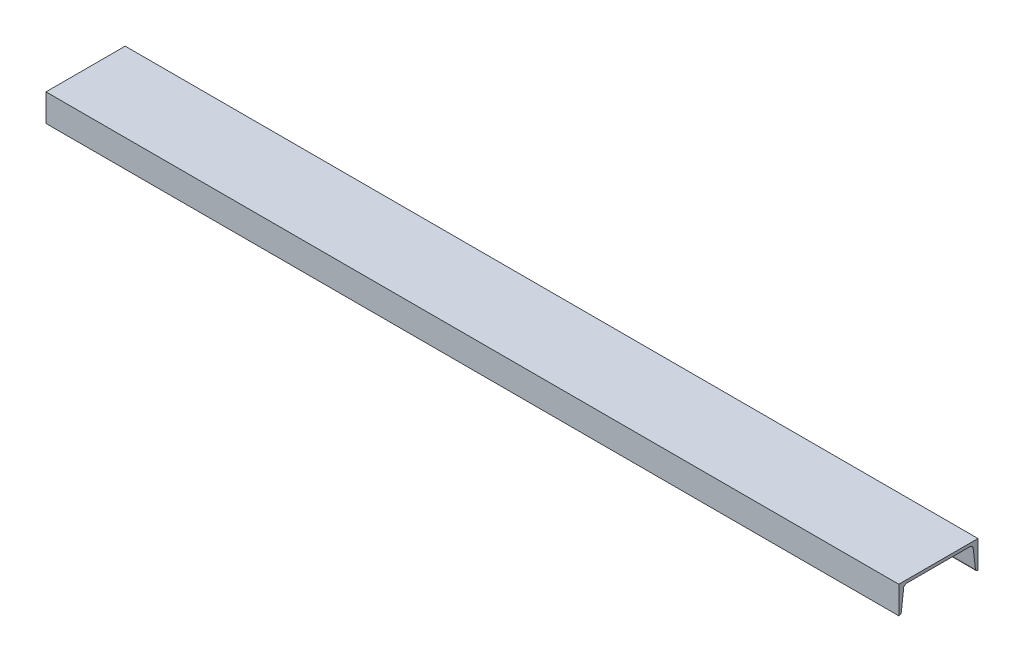
ISO-10303-21;
HEADER;
FILE_DESCRIPTION(('STEP AP214'),'2;1');
FILE_NAME('part.step','',(''),(''),'','','');
FILE_SCHEMA(('AUTOMOTIVE_DESIGN { 1 0 10303 214 1 1 1 1 }'));
ENDSEC;
DATA;
#1=APPLICATION_CONTEXT('core data for automotive mechanical design processes');
#2=APPLICATION_PROTOCOL_DEFINITION('international standard','automotive_design',2000,#1);
#3=PRODUCT_CONTEXT('',#1,'mechanical');
#4=PRODUCT('Part','Part','',(#3));
#5=PRODUCT_RELATED_PRODUCT_CATEGORY('part','',(#4));
#6=PRODUCT_DEFINITION_FORMATION('','',#4);
#7=PRODUCT_DEFINITION_CONTEXT('part definition',#1,'design');
#8=PRODUCT_DEFINITION('design','',#6,#7);
#9=PRODUCT_DEFINITION_SHAPE('','',#8);
#10=(LENGTH_UNIT() NAMED_UNIT(*) SI_UNIT(.MILLI.,.METRE.));
#11=(NAMED_UNIT(*) PLANE_ANGLE_UNIT() SI_UNIT($,.RADIAN.));
#12=(NAMED_UNIT(*) SI_UNIT($,.STERADIAN.) SOLID_ANGLE_UNIT());
#13=UNCERTAINTY_MEASURE_WITH_UNIT(LENGTH_MEASURE(1.E-05),#10,'distance_accuracy_value','');
#14=(GEOMETRIC_REPRESENTATION_CONTEXT(3) GLOBAL_UNCERTAINTY_ASSIGNED_CONTEXT((#13)) GLOBAL_UNIT_ASSIGNED_CONTEXT((#10,
#11,#12)) REPRESENTATION_CONTEXT('',''));
#15=CARTESIAN_POINT('',(0.,0.,0.));
#16=DIRECTION('',(0.,0.,1.));
#17=DIRECTION('',(1.,0.,0.));
#18=AXIS2_PLACEMENT_3D('',#15,#16,#17);
#19=CARTESIAN_POINT('',(2800.,0.,130.));
#20=DIRECTION('',(0.,0.,-1.));
#21=DIRECTION('',(-1.,0.,0.));
#22=AXIS2_PLACEMENT_3D('',#19,#20,#21);
#23=PLANE('',#22);
#24=DIRECTION('',(0.,-1.,0.));
#25=VECTOR('',#24,1.);
#26=CARTESIAN_POINT('',(0.,0.,130.));
#27=LINE('',#26,#25);
#28=CARTESIAN_POINT('',(0.,0.,130.));
#29=VERTEX_POINT('',#28);
#30=CARTESIAN_POINT('',(0.,-90.,130.));
#31=VERTEX_POINT('',#30);
#32=EDGE_CURVE('E155',#29,#31,#27,.T.);
#33=ORIENTED_EDGE('',*,*,#32,.T.);
#34=DIRECTION('',(-1.,0.,0.));
#35=VECTOR('',#34,1.);
#36=CARTESIAN_POINT('',(2800.,-90.,130.));
#37=LINE('',#36,#35);
#38=CARTESIAN_POINT('',(2800.,-90.,130.));
#39=VERTEX_POINT('',#38);
#40=EDGE_CURVE('E11',#39,#31,#37,.T.);
#41=ORIENTED_EDGE('',*,*,#40,.F.);
#42=DIRECTION('',(0.,-1.,0.));
#43=VECTOR('',#42,1.);
#44=CARTESIAN_POINT('',(2800.,0.,130.));
#45=LINE('',#44,#43);
#46=CARTESIAN_POINT('',(2800.,0.,130.));
#47=VERTEX_POINT('',#46);
#48=EDGE_CURVE('E177',#47,#39,#45,.T.);
#49=ORIENTED_EDGE('',*,*,#48,.F.);
#50=DIRECTION('',(-1.,0.,0.));
#51=VECTOR('',#50,1.);
#52=CARTESIAN_POINT('',(2800.,0.,130.));
#53=LINE('',#52,#51);
#54=EDGE_CURVE('E151',#47,#29,#53,.T.);
#55=ORIENTED_EDGE('',*,*,#54,.T.);
#56=EDGE_LOOP('',(#33,#41,#49,#55));
#57=FACE_BOUND('',#56,.T.);
#58=ADVANCED_FACE('F35',(#57),#23,.F.);
#59=CARTESIAN_POINT('',(2800.,-90.,130.));
#60=DIRECTION('',(0.,1.,0.));
#61=DIRECTION('',(0.,0.,1.));
#62=AXIS2_PLACEMENT_3D('',#59,#60,#61);
#63=PLANE('',#62);
#64=DIRECTION('',(0.,0.,-1.));
#65=VECTOR('',#64,1.);
#66=CARTESIAN_POINT('',(0.,-90.,130.));
#67=LINE('',#66,#65);
#68=CARTESIAN_POINT('',(0.,-90.,128.678333405021));
#69=VERTEX_POINT('',#68);
#70=EDGE_CURVE('E158',#31,#69,#67,.T.);
#71=ORIENTED_EDGE('',*,*,#70,.T.);
#72=DIRECTION('',(-1.,0.,0.));
#73=VECTOR('',#72,1.);
#74=CARTESIAN_POINT('',(2800.,-90.,128.678333405021));
#75=LINE('',#74,#73);
#76=CARTESIAN_POINT('',(2800.,-90.,128.678333405021));
#77=VERTEX_POINT('',#76);
#78=EDGE_CURVE('E43',#77,#69,#75,.T.);
#79=ORIENTED_EDGE('',*,*,#78,.F.);
#80=DIRECTION('',(0.,0.,-1.));
#81=VECTOR('',#80,1.);
#82=CARTESIAN_POINT('',(2800.,-90.,130.));
#83=LINE('',#82,#81);
#84=EDGE_CURVE('E106',#39,#77,#83,.T.);
#85=ORIENTED_EDGE('',*,*,#84,.F.);
#86=ORIENTED_EDGE('',*,*,#40,.T.);
#87=EDGE_LOOP('',(#71,#79,#85,#86));
#88=FACE_BOUND('',#87,.T.);
#89=ADVANCED_FACE('F255',(#88),#63,.F.);
#90=CARTESIAN_POINT('',(2800.,-83.,128.678333405021));
#91=DIRECTION('',(-1.,0.,0.));
#92=DIRECTION('',(0.,0.,1.));
#93=AXIS2_PLACEMENT_3D('',#90,#91,#92);
#94=CYLINDRICAL_SURFACE('',#93,7.00000000000001);
#95=CARTESIAN_POINT('',(0.,-83.,128.678333405021));
#96=DIRECTION('',(1.,0.,0.));
#97=DIRECTION('',(0.,0.,-1.));
#98=AXIS2_PLACEMENT_3D('',#95,#96,#97);
#99=CIRCLE('',#98,7.00000000000001);
#100=CARTESIAN_POINT('',(0.,-83.8216184771156,121.726718982597));
#101=VERTEX_POINT('',#100);
#102=EDGE_CURVE('E160',#69,#101,#99,.T.);
#103=ORIENTED_EDGE('',*,*,#102,.T.);
#104=DIRECTION('',(-1.,0.,0.));
#105=VECTOR('',#104,1.);
#106=CARTESIAN_POINT('',(2800.,-83.8216184771156,121.726718982597));
#107=LINE('',#106,#105);
#108=CARTESIAN_POINT('',(2800.,-83.8216184771156,121.726718982597));
#109=VERTEX_POINT('',#108);
#110=EDGE_CURVE('E196',#109,#101,#107,.T.);
#111=ORIENTED_EDGE('',*,*,#110,.F.);
#112=CARTESIAN_POINT('',(2800.,-83.,128.678333405021));
#113=DIRECTION('',(1.,0.,0.));
#114=DIRECTION('',(0.,0.,-1.));
#115=AXIS2_PLACEMENT_3D('',#112,#113,#114);
#116=CIRCLE('',#115,7.00000000000001);
#117=EDGE_CURVE('E204',#77,#109,#116,.T.);
#118=ORIENTED_EDGE('',*,*,#117,.F.);
#119=ORIENTED_EDGE('',*,*,#78,.T.);
#120=EDGE_LOOP('',(#103,#111,#118,#119));
#121=FACE_BOUND('',#120,.T.);
#122=ADVANCED_FACE('F202',(#121),#94,.T.);
#123=CARTESIAN_POINT('',(2800.,-16.7206222894941,113.795983048398));
#124=DIRECTION('',(0.,0.117374068159373,0.993087774632091));
#125=DIRECTION('',(0.,-0.993087774632091,0.117374068159373));
#126=AXIS2_PLACEMENT_3D('',#123,#124,#125);
#127=PLANE('',#126);
#128=DIRECTION('',(0.,0.993087774632091,-0.117374068159373));
#129=VECTOR('',#128,1.);
#130=CARTESIAN_POINT('',(0.,-16.7206222894941,113.795983048398));
#131=LINE('',#130,#129);
#132=CARTESIAN_POINT('',(0.,-16.7206222894941,113.795983048398));
#133=VERTEX_POINT('',#132);
#134=EDGE_CURVE('E162',#101,#133,#131,.T.);
#135=ORIENTED_EDGE('',*,*,#134,.T.);
#136=DIRECTION('',(-1.,0.,0.));
#137=VECTOR('',#136,1.);
#138=CARTESIAN_POINT('',(2800.,-16.7206222894941,113.795983048398));
#139=LINE('',#138,#137);
#140=CARTESIAN_POINT('',(2800.,-16.7206222894941,113.795983048398));
#141=VERTEX_POINT('',#140);
#142=EDGE_CURVE('E193',#141,#133,#139,.T.);
#143=ORIENTED_EDGE('',*,*,#142,.F.);
#144=DIRECTION('',(0.,0.993087774632091,-0.117374068159373));
#145=VECTOR('',#144,1.);
#146=CARTESIAN_POINT('',(2800.,-16.7206222894941,113.795983048398));
#147=LINE('',#146,#145);
#148=EDGE_CURVE('E222',#109,#141,#147,.T.);
#149=ORIENTED_EDGE('',*,*,#148,.F.);
#150=ORIENTED_EDGE('',*,*,#110,.T.);
#151=EDGE_LOOP('',(#135,#143,#149,#150));
#152=FACE_BOUND('',#151,.T.);
#153=ADVANCED_FACE('F213',(#152),#127,.F.);
#154=CARTESIAN_POINT('',(2800.,-24.,101.837276590433));
#155=DIRECTION('',(-1.,0.,0.));
#156=DIRECTION('',(0.,0.,1.));
#157=AXIS2_PLACEMENT_3D('',#154,#155,#156);
#158=CYLINDRICAL_SURFACE('',#157,14.);
#159=CARTESIAN_POINT('',(0.,-24.,101.837276590433));
#160=DIRECTION('',(-1.,0.,0.));
#161=DIRECTION('',(0.,0.,-1.));
#162=AXIS2_PLACEMENT_3D('',#159,#160,#161);
#163=CIRCLE('',#162,14.);
#164=CARTESIAN_POINT('',(0.,-10.,101.837276590433));
#165=VERTEX_POINT('',#164);
#166=EDGE_CURVE('E164',#133,#165,#163,.T.);
#167=ORIENTED_EDGE('',*,*,#166,.T.);
#168=DIRECTION('',(-1.,0.,0.));
#169=VECTOR('',#168,1.);
#170=CARTESIAN_POINT('',(2800.,-10.,101.837276590433));
#171=LINE('',#170,#169);
#172=CARTESIAN_POINT('',(2800.,-10.,101.837276590433));
#173=VERTEX_POINT('',#172);
#174=EDGE_CURVE('E190',#173,#165,#171,.T.);
#175=ORIENTED_EDGE('',*,*,#174,.F.);
#176=CARTESIAN_POINT('',(2800.,-24.,101.837276590433));
#177=DIRECTION('',(-1.,0.,0.));
#178=DIRECTION('',(0.,0.,-1.));
#179=AXIS2_PLACEMENT_3D('',#176,#177,#178);
#180=CIRCLE('',#179,14.);
#181=EDGE_CURVE('E219',#141,#173,#180,.T.);
#182=ORIENTED_EDGE('',*,*,#181,.F.);
#183=ORIENTED_EDGE('',*,*,#142,.T.);
#184=EDGE_LOOP('',(#167,#175,#182,#183));
#185=FACE_BOUND('',#184,.T.);
#186=ADVANCED_FACE('F217',(#185),#158,.F.);
#187=CARTESIAN_POINT('',(2800.,-9.99999999999998,-101.837276590433));
#188=DIRECTION('',(0.,1.,0.));
#189=DIRECTION('',(0.,0.,1.));
#190=AXIS2_PLACEMENT_3D('',#187,#188,#189);
#191=PLANE('',#190);
#192=DIRECTION('',(0.,0.,-1.));
#193=VECTOR('',#192,1.);
#194=CARTESIAN_POINT('',(0.,-9.99999999999998,-101.837276590433));
#195=LINE('',#194,#193);
#196=CARTESIAN_POINT('',(0.,-9.99999999999997,-101.837276590433));
#197=VERTEX_POINT('',#196);
#198=EDGE_CURVE('E166',#165,#197,#195,.T.);
#199=ORIENTED_EDGE('',*,*,#198,.T.);
#200=DIRECTION('',(-1.,0.,0.));
#201=VECTOR('',#200,1.);
#202=CARTESIAN_POINT('',(2800.,-9.99999999999997,-101.837276590433));
#203=LINE('',#202,#201);
#204=CARTESIAN_POINT('',(2800.,-9.99999999999997,-101.837276590433));
#205=VERTEX_POINT('',#204);
#206=EDGE_CURVE('E187',#205,#197,#203,.T.);
#207=ORIENTED_EDGE('',*,*,#206,.F.);
#208=DIRECTION('',(0.,0.,-1.));
#209=VECTOR('',#208,1.);
#210=CARTESIAN_POINT('',(2800.,-9.99999999999998,-101.837276590433));
#211=LINE('',#210,#209);
#212=EDGE_CURVE('E221',#173,#205,#211,.T.);
#213=ORIENTED_EDGE('',*,*,#212,.F.);
#214=ORIENTED_EDGE('',*,*,#174,.T.);
#215=EDGE_LOOP('',(#199,#207,#213,#214));
#216=FACE_BOUND('',#215,.T.);
#217=ADVANCED_FACE('F268',(#216),#191,.F.);
#218=CARTESIAN_POINT('',(2800.,-24.,-101.837276590433));
#219=DIRECTION('',(-1.,0.,0.));
#220=DIRECTION('',(0.,0.,1.));
#221=AXIS2_PLACEMENT_3D('',#218,#219,#220);
#222=CYLINDRICAL_SURFACE('',#221,14.);
#223=CARTESIAN_POINT('',(0.,-24.,-101.837276590433));
#224=DIRECTION('',(-1.,0.,0.));
#225=DIRECTION('',(0.,0.,1.));
#226=AXIS2_PLACEMENT_3D('',#223,#224,#225);
#227=CIRCLE('',#226,14.);
#228=CARTESIAN_POINT('',(0.,-16.7206222894941,-113.795983048398));
#229=VERTEX_POINT('',#228);
#230=EDGE_CURVE('E168',#197,#229,#227,.T.);
#231=ORIENTED_EDGE('',*,*,#230,.T.);
#232=DIRECTION('',(-1.,0.,0.));
#233=VECTOR('',#232,1.);
#234=CARTESIAN_POINT('',(2800.,-16.7206222894941,-113.795983048398));
#235=LINE('',#234,#233);
#236=CARTESIAN_POINT('',(2800.,-16.7206222894941,-113.795983048398));
#237=VERTEX_POINT('',#236);
#238=EDGE_CURVE('E184',#237,#229,#235,.T.);
#239=ORIENTED_EDGE('',*,*,#238,.F.);
#240=CARTESIAN_POINT('',(2800.,-24.,-101.837276590433));
#241=DIRECTION('',(-1.,0.,0.));
#242=DIRECTION('',(0.,0.,1.));
#243=AXIS2_PLACEMENT_3D('',#240,#241,#242);
#244=CIRCLE('',#243,14.);
#245=EDGE_CURVE('E224',#205,#237,#244,.T.);
#246=ORIENTED_EDGE('',*,*,#245,.F.);
#247=ORIENTED_EDGE('',*,*,#206,.T.);
#248=EDGE_LOOP('',(#231,#239,#246,#247));
#249=FACE_BOUND('',#248,.T.);
#250=ADVANCED_FACE('F271',(#249),#222,.F.);
#251=CARTESIAN_POINT('',(2800.,-16.7206222894941,-113.795983048398));
#252=DIRECTION('',(0.,0.117374068159373,-0.993087774632091));
#253=DIRECTION('',(0.,0.993087774632091,0.117374068159373));
#254=AXIS2_PLACEMENT_3D('',#251,#252,#253);
#255=PLANE('',#254);
#256=DIRECTION('',(0.,-0.993087774632091,-0.117374068159373));
#257=VECTOR('',#256,1.);
#258=CARTESIAN_POINT('',(0.,-16.7206222894941,-113.795983048398));
#259=LINE('',#258,#257);
#260=CARTESIAN_POINT('',(0.,-83.8216184771156,-121.726718982597));
#261=VERTEX_POINT('',#260);
#262=EDGE_CURVE('E170',#229,#261,#259,.T.);
#263=ORIENTED_EDGE('',*,*,#262,.T.);
#264=DIRECTION('',(-1.,0.,0.));
#265=VECTOR('',#264,1.);
#266=CARTESIAN_POINT('',(2800.,-83.8216184771156,-121.726718982597));
#267=LINE('',#266,#265);
#268=CARTESIAN_POINT('',(2800.,-83.8216184771156,-121.726718982597));
#269=VERTEX_POINT('',#268);
#270=EDGE_CURVE('E181',#269,#261,#267,.T.);
#271=ORIENTED_EDGE('',*,*,#270,.F.);
#272=DIRECTION('',(0.,-0.993087774632091,-0.117374068159373));
#273=VECTOR('',#272,1.);
#274=CARTESIAN_POINT('',(2800.,-16.7206222894941,-113.795983048398));
#275=LINE('',#274,#273);
#276=EDGE_CURVE('E230',#237,#269,#275,.T.);
#277=ORIENTED_EDGE('',*,*,#276,.F.);
#278=ORIENTED_EDGE('',*,*,#238,.T.);
#279=EDGE_LOOP('',(#263,#271,#277,#278));
#280=FACE_BOUND('',#279,.T.);
#281=ADVANCED_FACE('F236',(#280),#255,.F.);
#282=CARTESIAN_POINT('',(2800.,-83.,-128.678333405021));
#283=DIRECTION('',(-1.,0.,0.));
#284=DIRECTION('',(0.,0.,1.));
#285=AXIS2_PLACEMENT_3D('',#282,#283,#284);
#286=CYLINDRICAL_SURFACE('',#285,6.99999999999999);
#287=CARTESIAN_POINT('',(0.,-83.,-128.678333405021));
#288=DIRECTION('',(1.,0.,0.));
#289=DIRECTION('',(0.,0.,1.));
#290=AXIS2_PLACEMENT_3D('',#287,#288,#289);
#291=CIRCLE('',#290,6.99999999999999);
#292=CARTESIAN_POINT('',(0.,-90.,-128.678333405021));
#293=VERTEX_POINT('',#292);
#294=EDGE_CURVE('E172',#261,#293,#291,.T.);
#295=ORIENTED_EDGE('',*,*,#294,.T.);
#296=DIRECTION('',(-1.,0.,0.));
#297=VECTOR('',#296,1.);
#298=CARTESIAN_POINT('',(2800.,-90.,-128.678333405021));
#299=LINE('',#298,#297);
#300=CARTESIAN_POINT('',(2800.,-90.,-128.678333405021));
#301=VERTEX_POINT('',#300);
#302=EDGE_CURVE('E146',#301,#293,#299,.T.);
#303=ORIENTED_EDGE('',*,*,#302,.F.);
#304=CARTESIAN_POINT('',(2800.,-83.,-128.678333405021));
#305=DIRECTION('',(1.,0.,0.));
#306=DIRECTION('',(0.,0.,1.));
#307=AXIS2_PLACEMENT_3D('',#304,#305,#306);
#308=CIRCLE('',#307,6.99999999999999);
#309=EDGE_CURVE('E137',#269,#301,#308,.T.);
#310=ORIENTED_EDGE('',*,*,#309,.F.);
#311=ORIENTED_EDGE('',*,*,#270,.T.);
#312=EDGE_LOOP('',(#295,#303,#310,#311));
#313=FACE_BOUND('',#312,.T.);
#314=ADVANCED_FACE('F240',(#313),#286,.T.);
#315=CARTESIAN_POINT('',(2800.,-90.,-130.));
#316=DIRECTION('',(0.,1.,0.));
#317=DIRECTION('',(0.,0.,1.));
#318=AXIS2_PLACEMENT_3D('',#315,#316,#317);
#319=PLANE('',#318);
#320=DIRECTION('',(0.,0.,-1.));
#321=VECTOR('',#320,1.);
#322=CARTESIAN_POINT('',(0.,-90.,-130.));
#323=LINE('',#322,#321);
#324=CARTESIAN_POINT('',(0.,-90.,-130.));
#325=VERTEX_POINT('',#324);
#326=EDGE_CURVE('E145',#293,#325,#323,.T.);
#327=ORIENTED_EDGE('',*,*,#326,.T.);
#328=DIRECTION('',(-1.,0.,0.));
#329=VECTOR('',#328,1.);
#330=CARTESIAN_POINT('',(2800.,-90.,-130.));
#331=LINE('',#330,#329);
#332=CARTESIAN_POINT('',(2800.,-90.,-130.));
#333=VERTEX_POINT('',#332);
#334=EDGE_CURVE('E142',#333,#325,#331,.T.);
#335=ORIENTED_EDGE('',*,*,#334,.F.);
#336=DIRECTION('',(0.,0.,-1.));
#337=VECTOR('',#336,1.);
#338=CARTESIAN_POINT('',(2800.,-90.,-130.));
#339=LINE('',#338,#337);
#340=EDGE_CURVE('E131',#301,#333,#339,.T.);
#341=ORIENTED_EDGE('',*,*,#340,.F.);
#342=ORIENTED_EDGE('',*,*,#302,.T.);
#343=EDGE_LOOP('',(#327,#335,#341,#342));
#344=FACE_BOUND('',#343,.T.);
#345=ADVANCED_FACE('F143',(#344),#319,.F.);
#346=CARTESIAN_POINT('',(2800.,0.,-130.));
#347=DIRECTION('',(0.,0.,1.));
#348=DIRECTION('',(1.,0.,0.));
#349=AXIS2_PLACEMENT_3D('',#346,#347,#348);
#350=PLANE('',#349);
#351=DIRECTION('',(0.,1.,0.));
#352=VECTOR('',#351,1.);
#353=CARTESIAN_POINT('',(0.,0.,-130.));
#354=LINE('',#353,#352);
#355=CARTESIAN_POINT('',(0.,0.,-130.));
#356=VERTEX_POINT('',#355);
#357=EDGE_CURVE('E92',#325,#356,#354,.T.);
#358=ORIENTED_EDGE('',*,*,#357,.T.);
#359=DIRECTION('',(-1.,0.,0.));
#360=VECTOR('',#359,1.);
#361=CARTESIAN_POINT('',(2800.,0.,-130.));
#362=LINE('',#361,#360);
#363=CARTESIAN_POINT('',(2800.,0.,-130.));
#364=VERTEX_POINT('',#363);
#365=EDGE_CURVE('E147',#364,#356,#362,.T.);
#366=ORIENTED_EDGE('',*,*,#365,.F.);
#367=DIRECTION('',(0.,1.,0.));
#368=VECTOR('',#367,1.);
#369=CARTESIAN_POINT('',(2800.,0.,-130.));
#370=LINE('',#369,#368);
#371=EDGE_CURVE('E135',#333,#364,#370,.T.);
#372=ORIENTED_EDGE('',*,*,#371,.F.);
#373=ORIENTED_EDGE('',*,*,#334,.T.);
#374=EDGE_LOOP('',(#358,#366,#372,#373));
#375=FACE_BOUND('',#374,.T.);
#376=ADVANCED_FACE('F149',(#375),#350,.F.);
#377=CARTESIAN_POINT('',(2800.,0.,-130.));
#378=DIRECTION('',(0.,-1.,0.));
#379=DIRECTION('',(0.,0.,-1.));
#380=AXIS2_PLACEMENT_3D('',#377,#378,#379);
#381=PLANE('',#380);
#382=DIRECTION('',(0.,0.,1.));
#383=VECTOR('',#382,1.);
#384=CARTESIAN_POINT('',(0.,0.,-130.));
#385=LINE('',#384,#383);
#386=EDGE_CURVE('E98',#356,#29,#385,.T.);
#387=ORIENTED_EDGE('',*,*,#386,.T.);
#388=ORIENTED_EDGE('',*,*,#54,.F.);
#389=DIRECTION('',(0.,0.,1.));
#390=VECTOR('',#389,1.);
#391=CARTESIAN_POINT('',(2800.,0.,-130.));
#392=LINE('',#391,#390);
#393=EDGE_CURVE('E51',#364,#47,#392,.T.);
#394=ORIENTED_EDGE('',*,*,#393,.F.);
#395=ORIENTED_EDGE('',*,*,#365,.T.);
#396=EDGE_LOOP('',(#387,#388,#394,#395));
#397=FACE_BOUND('',#396,.T.);
#398=ADVANCED_FACE('F244',(#397),#381,.F.);
#399=CARTESIAN_POINT('',(2800.,-83.,128.678333405021));
#400=DIRECTION('',(1.,0.,0.));
#401=DIRECTION('',(0.,0.,-1.));
#402=AXIS2_PLACEMENT_3D('',#399,#400,#401);
#403=PLANE('',#402);
#404=ORIENTED_EDGE('',*,*,#48,.T.);
#405=ORIENTED_EDGE('',*,*,#84,.T.);
#406=ORIENTED_EDGE('',*,*,#117,.T.);
#407=ORIENTED_EDGE('',*,*,#148,.T.);
#408=ORIENTED_EDGE('',*,*,#181,.T.);
#409=ORIENTED_EDGE('',*,*,#212,.T.);
#410=ORIENTED_EDGE('',*,*,#245,.T.);
#411=ORIENTED_EDGE('',*,*,#276,.T.);
#412=ORIENTED_EDGE('',*,*,#309,.T.);
#413=ORIENTED_EDGE('',*,*,#340,.T.);
#414=ORIENTED_EDGE('',*,*,#371,.T.);
#415=ORIENTED_EDGE('',*,*,#393,.T.);
#416=EDGE_LOOP('',(#404,#405,#406,#407,#408,#409,#410,#411,#412,#413,#414,#415));
#417=FACE_BOUND('',#416,.T.);
#418=ADVANCED_FACE('F133',(#417),#403,.T.);
#419=CARTESIAN_POINT('',(0.,-83.,128.678333405021));
#420=DIRECTION('',(1.,0.,0.));
#421=DIRECTION('',(0.,0.,-1.));
#422=AXIS2_PLACEMENT_3D('',#419,#420,#421);
#423=PLANE('',#422);
#424=ORIENTED_EDGE('',*,*,#32,.F.);
#425=ORIENTED_EDGE('',*,*,#386,.F.);
#426=ORIENTED_EDGE('',*,*,#357,.F.);
#427=ORIENTED_EDGE('',*,*,#326,.F.);
#428=ORIENTED_EDGE('',*,*,#294,.F.);
#429=ORIENTED_EDGE('',*,*,#262,.F.);
#430=ORIENTED_EDGE('',*,*,#230,.F.);
#431=ORIENTED_EDGE('',*,*,#198,.F.);
#432=ORIENTED_EDGE('',*,*,#166,.F.);
#433=ORIENTED_EDGE('',*,*,#134,.F.);
#434=ORIENTED_EDGE('',*,*,#102,.F.);
#435=ORIENTED_EDGE('',*,*,#70,.F.);
#436=EDGE_LOOP('',(#424,#425,#426,#427,#428,#429,#430,#431,#432,#433,#434,#435));
#437=FACE_BOUND('',#436,.T.);
#438=ADVANCED_FACE('F208',(#437),#423,.F.);
#439=CLOSED_SHELL('',(#58,#89,#122,#153,#186,#217,#250,#281,#314,#345,#376,#398,#418,#438));
#440=MANIFOLD_SOLID_BREP('B2',#439);
#441=ADVANCED_BREP_SHAPE_REPRESENTATION('',(#18,#440),#14);
#442=SHAPE_DEFINITION_REPRESENTATION(#9,#441);
ENDSEC;
END-ISO-10303-21;
